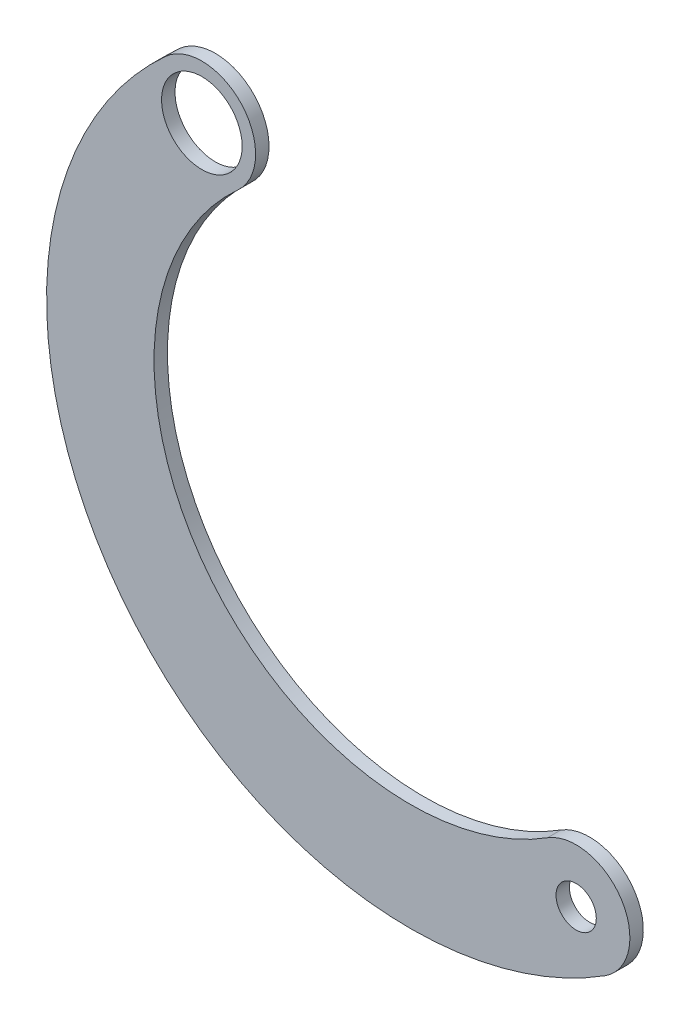
ISO-10303-21;
HEADER;
FILE_DESCRIPTION(('STEP AP214'),'2;1');
FILE_NAME('part.step','',(''),(''),'','','');
FILE_SCHEMA(('AUTOMOTIVE_DESIGN { 1 0 10303 214 1 1 1 1 }'));
ENDSEC;
DATA;
#1=APPLICATION_CONTEXT('core data for automotive mechanical design processes');
#2=APPLICATION_PROTOCOL_DEFINITION('international standard','automotive_design',2000,#1);
#3=PRODUCT_CONTEXT('',#1,'mechanical');
#4=PRODUCT('Part','Part','',(#3));
#5=PRODUCT_RELATED_PRODUCT_CATEGORY('part','',(#4));
#6=PRODUCT_DEFINITION_FORMATION('','',#4);
#7=PRODUCT_DEFINITION_CONTEXT('part definition',#1,'design');
#8=PRODUCT_DEFINITION('design','',#6,#7);
#9=PRODUCT_DEFINITION_SHAPE('','',#8);
#10=(LENGTH_UNIT() NAMED_UNIT(*) SI_UNIT(.MILLI.,.METRE.));
#11=(NAMED_UNIT(*) PLANE_ANGLE_UNIT() SI_UNIT($,.RADIAN.));
#12=(NAMED_UNIT(*) SI_UNIT($,.STERADIAN.) SOLID_ANGLE_UNIT());
#13=UNCERTAINTY_MEASURE_WITH_UNIT(LENGTH_MEASURE(1.E-05),#10,'distance_accuracy_value','');
#14=(GEOMETRIC_REPRESENTATION_CONTEXT(3) GLOBAL_UNCERTAINTY_ASSIGNED_CONTEXT((#13)) GLOBAL_UNIT_ASSIGNED_CONTEXT((#10,
#11,#12)) REPRESENTATION_CONTEXT('',''));
#15=CARTESIAN_POINT('',(0.,0.,0.));
#16=DIRECTION('',(0.,0.,1.));
#17=DIRECTION('',(1.,0.,0.));
#18=AXIS2_PLACEMENT_3D('',#15,#16,#17);
#19=CARTESIAN_POINT('',(0.618102591140791,-3.54665279795997,1.));
#20=DIRECTION('',(0.,0.,1.));
#21=DIRECTION('',(1.,0.,0.));
#22=AXIS2_PLACEMENT_3D('',#19,#20,#21);
#23=PLANE('',#22);
#24=CARTESIAN_POINT('',(20.7230029461696,-31.6009391320367,1.));
#25=DIRECTION('',(0.,0.,1.));
#26=DIRECTION('',(1.,0.,0.));
#27=AXIS2_PLACEMENT_3D('',#24,#25,#26);
#28=CIRCLE('',#27,1.50000000000001);
#29=CARTESIAN_POINT('',(22.2230029461696,-31.6009391320367,1.));
#30=VERTEX_POINT('',#29);
#31=EDGE_CURVE('E108',#30,#30,#28,.T.);
#32=ORIENTED_EDGE('',*,*,#31,.F.);
#33=EDGE_LOOP('',(#32));
#34=FACE_BOUND('',#33,.T.);
#35=CARTESIAN_POINT('',(-7.14434146919093,4.99702686657689,1.));
#36=DIRECTION('',(0.,0.,1.));
#37=DIRECTION('',(1.,0.,0.));
#38=AXIS2_PLACEMENT_3D('',#35,#36,#37);
#39=CIRCLE('',#38,4.);
#40=CARTESIAN_POINT('',(-4.45451126519061,2.03648409984518,1.));
#41=VERTEX_POINT('',#40);
#42=CARTESIAN_POINT('',(-9.83417167319127,7.95756963330863,1.));
#43=VERTEX_POINT('',#42);
#44=EDGE_CURVE('E93',#41,#43,#39,.T.);
#45=ORIENTED_EDGE('',*,*,#44,.T.);
#46=CARTESIAN_POINT('',(8.38054665147251,-12.0903324624968,1.));
#47=DIRECTION('',(0.,0.,1.));
#48=DIRECTION('',(1.,0.,0.));
#49=AXIS2_PLACEMENT_3D('',#46,#47,#48);
#50=CIRCLE('',#49,27.0867927612304);
#51=CARTESIAN_POINT('',(22.8614474537884,-34.9813318736918,1.));
#52=VERTEX_POINT('',#51);
#53=EDGE_CURVE('E88',#43,#52,#50,.T.);
#54=ORIENTED_EDGE('',*,*,#53,.T.);
#55=CARTESIAN_POINT('',(20.7230029461696,-31.6009391320367,1.));
#56=DIRECTION('',(0.,0.,1.));
#57=DIRECTION('',(1.,0.,0.));
#58=AXIS2_PLACEMENT_3D('',#55,#56,#57);
#59=CIRCLE('',#58,4.);
#60=CARTESIAN_POINT('',(18.5845584385507,-28.2205463903816,1.));
#61=VERTEX_POINT('',#60);
#62=EDGE_CURVE('E91',#52,#61,#59,.T.);
#63=ORIENTED_EDGE('',*,*,#62,.T.);
#64=CARTESIAN_POINT('',(8.38054665147251,-12.0903324624968,1.));
#65=DIRECTION('',(0.,0.,-1.));
#66=DIRECTION('',(1.,0.,0.));
#67=AXIS2_PLACEMENT_3D('',#64,#65,#66);
#68=CIRCLE('',#67,19.0867927612304);
#69=EDGE_CURVE('E58',#61,#41,#68,.T.);
#70=ORIENTED_EDGE('',*,*,#69,.T.);
#71=EDGE_LOOP('',(#45,#54,#63,#70));
#72=FACE_BOUND('',#71,.T.);
#73=CARTESIAN_POINT('',(-7.14434146919093,4.99702686657689,1.));
#74=DIRECTION('',(0.,0.,1.));
#75=DIRECTION('',(1.,0.,0.));
#76=AXIS2_PLACEMENT_3D('',#73,#74,#75);
#77=CIRCLE('',#76,3.);
#78=CARTESIAN_POINT('',(-4.14434146919093,4.99702686657689,1.));
#79=VERTEX_POINT('',#78);
#80=EDGE_CURVE('E123',#79,#79,#77,.T.);
#81=ORIENTED_EDGE('',*,*,#80,.F.);
#82=EDGE_LOOP('',(#81));
#83=FACE_BOUND('',#82,.T.);
#84=ADVANCED_FACE('F41',(#34,#72,#83),#23,.T.);
#85=CARTESIAN_POINT('',(0.618102591140791,-3.54665279795997,0.));
#86=DIRECTION('',(0.,0.,1.));
#87=DIRECTION('',(1.,0.,0.));
#88=AXIS2_PLACEMENT_3D('',#85,#86,#87);
#89=PLANE('',#88);
#90=CARTESIAN_POINT('',(-7.14434146919093,4.99702686657689,0.));
#91=DIRECTION('',(0.,0.,1.));
#92=DIRECTION('',(1.,0.,0.));
#93=AXIS2_PLACEMENT_3D('',#90,#91,#92);
#94=CIRCLE('',#93,4.);
#95=CARTESIAN_POINT('',(-4.45451126519061,2.03648409984518,0.));
#96=VERTEX_POINT('',#95);
#97=CARTESIAN_POINT('',(-9.83417167319127,7.95756963330863,0.));
#98=VERTEX_POINT('',#97);
#99=EDGE_CURVE('E105',#96,#98,#94,.T.);
#100=ORIENTED_EDGE('',*,*,#99,.F.);
#101=CARTESIAN_POINT('',(8.38054665147251,-12.0903324624968,0.));
#102=DIRECTION('',(0.,0.,-1.));
#103=DIRECTION('',(1.,0.,0.));
#104=AXIS2_PLACEMENT_3D('',#101,#102,#103);
#105=CIRCLE('',#104,19.0867927612304);
#106=CARTESIAN_POINT('',(18.5845584385507,-28.2205463903816,0.));
#107=VERTEX_POINT('',#106);
#108=EDGE_CURVE('E81',#107,#96,#105,.T.);
#109=ORIENTED_EDGE('',*,*,#108,.F.);
#110=CARTESIAN_POINT('',(20.7230029461696,-31.6009391320367,0.));
#111=DIRECTION('',(0.,0.,1.));
#112=DIRECTION('',(1.,0.,0.));
#113=AXIS2_PLACEMENT_3D('',#110,#111,#112);
#114=CIRCLE('',#113,4.);
#115=CARTESIAN_POINT('',(22.8614474537884,-34.9813318736918,0.));
#116=VERTEX_POINT('',#115);
#117=EDGE_CURVE('E75',#116,#107,#114,.T.);
#118=ORIENTED_EDGE('',*,*,#117,.F.);
#119=CARTESIAN_POINT('',(8.38054665147251,-12.0903324624968,0.));
#120=DIRECTION('',(0.,0.,1.));
#121=DIRECTION('',(1.,0.,0.));
#122=AXIS2_PLACEMENT_3D('',#119,#120,#121);
#123=CIRCLE('',#122,27.0867927612304);
#124=EDGE_CURVE('E97',#98,#116,#123,.T.);
#125=ORIENTED_EDGE('',*,*,#124,.F.);
#126=EDGE_LOOP('',(#100,#109,#118,#125));
#127=FACE_BOUND('',#126,.T.);
#128=CARTESIAN_POINT('',(20.7230029461696,-31.6009391320367,0.));
#129=DIRECTION('',(0.,0.,1.));
#130=DIRECTION('',(1.,0.,0.));
#131=AXIS2_PLACEMENT_3D('',#128,#129,#130);
#132=CIRCLE('',#131,1.50000000000001);
#133=CARTESIAN_POINT('',(22.2230029461696,-31.6009391320367,0.));
#134=VERTEX_POINT('',#133);
#135=EDGE_CURVE('E120',#134,#134,#132,.T.);
#136=ORIENTED_EDGE('',*,*,#135,.T.);
#137=EDGE_LOOP('',(#136));
#138=FACE_BOUND('',#137,.T.);
#139=CARTESIAN_POINT('',(-7.14434146919093,4.99702686657689,0.));
#140=DIRECTION('',(0.,0.,1.));
#141=DIRECTION('',(1.,0.,0.));
#142=AXIS2_PLACEMENT_3D('',#139,#140,#141);
#143=CIRCLE('',#142,3.);
#144=CARTESIAN_POINT('',(-4.14434146919093,4.99702686657689,0.));
#145=VERTEX_POINT('',#144);
#146=EDGE_CURVE('E126',#145,#145,#143,.T.);
#147=ORIENTED_EDGE('',*,*,#146,.T.);
#148=EDGE_LOOP('',(#147));
#149=FACE_BOUND('',#148,.T.);
#150=ADVANCED_FACE('F116',(#127,#138,#149),#89,.F.);
#151=CARTESIAN_POINT('',(-7.14434146919093,4.99702686657689,1.));
#152=DIRECTION('',(0.,0.,-1.));
#153=DIRECTION('',(-1.,0.,0.));
#154=AXIS2_PLACEMENT_3D('',#151,#152,#153);
#155=CYLINDRICAL_SURFACE('',#154,4.);
#156=ORIENTED_EDGE('',*,*,#99,.T.);
#157=DIRECTION('',(0.,0.,-1.));
#158=VECTOR('',#157,1.);
#159=CARTESIAN_POINT('',(-9.83417167319127,7.95756963330863,1.));
#160=LINE('',#159,#158);
#161=EDGE_CURVE('E11',#43,#98,#160,.T.);
#162=ORIENTED_EDGE('',*,*,#161,.F.);
#163=ORIENTED_EDGE('',*,*,#44,.F.);
#164=DIRECTION('',(0.,0.,-1.));
#165=VECTOR('',#164,1.);
#166=CARTESIAN_POINT('',(-4.45451126519061,2.03648409984518,1.));
#167=LINE('',#166,#165);
#168=EDGE_CURVE('E101',#41,#96,#167,.T.);
#169=ORIENTED_EDGE('',*,*,#168,.T.);
#170=EDGE_LOOP('',(#156,#162,#163,#169));
#171=FACE_BOUND('',#170,.T.);
#172=ADVANCED_FACE('F43',(#171),#155,.T.);
#173=CARTESIAN_POINT('',(8.38054665147251,-12.0903324624968,1.));
#174=DIRECTION('',(0.,0.,-1.));
#175=DIRECTION('',(-1.,0.,0.));
#176=AXIS2_PLACEMENT_3D('',#173,#174,#175);
#177=CYLINDRICAL_SURFACE('',#176,27.0867927612304);
#178=ORIENTED_EDGE('',*,*,#124,.T.);
#179=DIRECTION('',(0.,0.,-1.));
#180=VECTOR('',#179,1.);
#181=CARTESIAN_POINT('',(22.8614474537884,-34.9813318736918,1.));
#182=LINE('',#181,#180);
#183=EDGE_CURVE('E50',#52,#116,#182,.T.);
#184=ORIENTED_EDGE('',*,*,#183,.F.);
#185=ORIENTED_EDGE('',*,*,#53,.F.);
#186=ORIENTED_EDGE('',*,*,#161,.T.);
#187=EDGE_LOOP('',(#178,#184,#185,#186));
#188=FACE_BOUND('',#187,.T.);
#189=ADVANCED_FACE('F96',(#188),#177,.T.);
#190=CARTESIAN_POINT('',(20.7230029461696,-31.6009391320367,1.));
#191=DIRECTION('',(0.,0.,-1.));
#192=DIRECTION('',(-1.,0.,0.));
#193=AXIS2_PLACEMENT_3D('',#190,#191,#192);
#194=CYLINDRICAL_SURFACE('',#193,4.);
#195=ORIENTED_EDGE('',*,*,#117,.T.);
#196=DIRECTION('',(0.,0.,-1.));
#197=VECTOR('',#196,1.);
#198=CARTESIAN_POINT('',(18.5845584385507,-28.2205463903816,1.));
#199=LINE('',#198,#197);
#200=EDGE_CURVE('E98',#61,#107,#199,.T.);
#201=ORIENTED_EDGE('',*,*,#200,.F.);
#202=ORIENTED_EDGE('',*,*,#62,.F.);
#203=ORIENTED_EDGE('',*,*,#183,.T.);
#204=EDGE_LOOP('',(#195,#201,#202,#203));
#205=FACE_BOUND('',#204,.T.);
#206=ADVANCED_FACE('F99',(#205),#194,.T.);
#207=CARTESIAN_POINT('',(8.38054665147251,-12.0903324624968,1.));
#208=DIRECTION('',(0.,0.,-1.));
#209=DIRECTION('',(-1.,0.,0.));
#210=AXIS2_PLACEMENT_3D('',#207,#208,#209);
#211=CYLINDRICAL_SURFACE('',#210,19.0867927612304);
#212=ORIENTED_EDGE('',*,*,#108,.T.);
#213=ORIENTED_EDGE('',*,*,#168,.F.);
#214=ORIENTED_EDGE('',*,*,#69,.F.);
#215=ORIENTED_EDGE('',*,*,#200,.T.);
#216=EDGE_LOOP('',(#212,#213,#214,#215));
#217=FACE_BOUND('',#216,.T.);
#218=ADVANCED_FACE('F113',(#217),#211,.F.);
#219=CARTESIAN_POINT('',(20.7230029461696,-31.6009391320367,1.));
#220=DIRECTION('',(0.,0.,-1.));
#221=DIRECTION('',(-1.,0.,0.));
#222=AXIS2_PLACEMENT_3D('',#219,#220,#221);
#223=CYLINDRICAL_SURFACE('',#222,1.50000000000001);
#224=ORIENTED_EDGE('',*,*,#31,.T.);
#225=EDGE_LOOP('',(#224));
#226=FACE_BOUND('',#225,.T.);
#227=ORIENTED_EDGE('',*,*,#135,.F.);
#228=EDGE_LOOP('',(#227));
#229=FACE_BOUND('',#228,.T.);
#230=ADVANCED_FACE('F143',(#226,#229),#223,.F.);
#231=CARTESIAN_POINT('',(-7.14434146919093,4.99702686657689,1.));
#232=DIRECTION('',(0.,0.,-1.));
#233=DIRECTION('',(-1.,0.,0.));
#234=AXIS2_PLACEMENT_3D('',#231,#232,#233);
#235=CYLINDRICAL_SURFACE('',#234,3.);
#236=ORIENTED_EDGE('',*,*,#80,.T.);
#237=EDGE_LOOP('',(#236));
#238=FACE_BOUND('',#237,.T.);
#239=ORIENTED_EDGE('',*,*,#146,.F.);
#240=EDGE_LOOP('',(#239));
#241=FACE_BOUND('',#240,.T.);
#242=ADVANCED_FACE('F132',(#238,#241),#235,.F.);
#243=CLOSED_SHELL('',(#84,#150,#172,#189,#206,#218,#230,#242));
#244=MANIFOLD_SOLID_BREP('B2',#243);
#245=ADVANCED_BREP_SHAPE_REPRESENTATION('',(#18,#244),#14);
#246=SHAPE_DEFINITION_REPRESENTATION(#9,#245);
ENDSEC;
END-ISO-10303-21;
